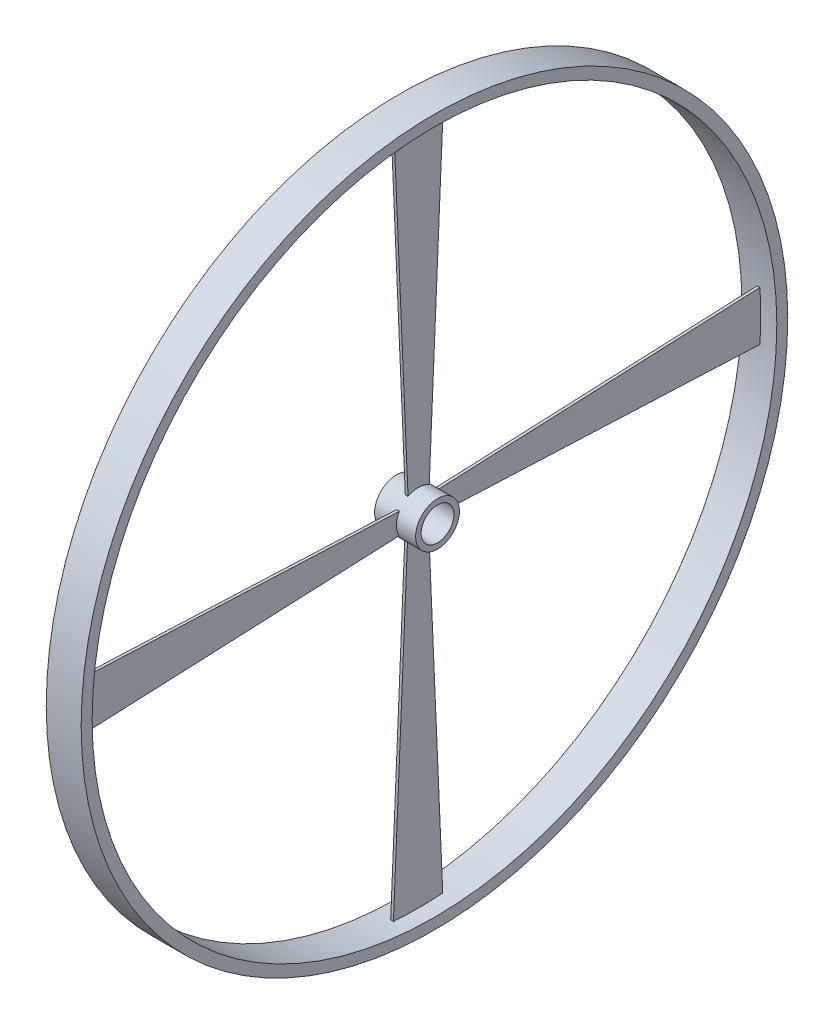
ISO-10303-21;
HEADER;
FILE_DESCRIPTION(('STEP AP214'),'2;1');
FILE_NAME('part.step','',(''),(''),'','','');
FILE_SCHEMA(('AUTOMOTIVE_DESIGN { 1 0 10303 214 1 1 1 1 }'));
ENDSEC;
DATA;
#1=APPLICATION_CONTEXT('core data for automotive mechanical design processes');
#2=APPLICATION_PROTOCOL_DEFINITION('international standard','automotive_design',2000,#1);
#3=PRODUCT_CONTEXT('',#1,'mechanical');
#4=PRODUCT('Part','Part','',(#3));
#5=PRODUCT_RELATED_PRODUCT_CATEGORY('part','',(#4));
#6=PRODUCT_DEFINITION_FORMATION('','',#4);
#7=PRODUCT_DEFINITION_CONTEXT('part definition',#1,'design');
#8=PRODUCT_DEFINITION('design','',#6,#7);
#9=PRODUCT_DEFINITION_SHAPE('','',#8);
#10=(LENGTH_UNIT() NAMED_UNIT(*) SI_UNIT(.MILLI.,.METRE.));
#11=(NAMED_UNIT(*) PLANE_ANGLE_UNIT() SI_UNIT($,.RADIAN.));
#12=(NAMED_UNIT(*) SI_UNIT($,.STERADIAN.) SOLID_ANGLE_UNIT());
#13=UNCERTAINTY_MEASURE_WITH_UNIT(LENGTH_MEASURE(1.E-05),#10,'distance_accuracy_value','');
#14=(GEOMETRIC_REPRESENTATION_CONTEXT(3) GLOBAL_UNCERTAINTY_ASSIGNED_CONTEXT((#13)) GLOBAL_UNIT_ASSIGNED_CONTEXT((#10,
#11,#12)) REPRESENTATION_CONTEXT('',''));
#15=CARTESIAN_POINT('',(0.,0.,0.));
#16=DIRECTION('',(0.,0.,1.));
#17=DIRECTION('',(1.,0.,0.));
#18=AXIS2_PLACEMENT_3D('',#15,#16,#17);
#19=CARTESIAN_POINT('',(6.375,0.,0.));
#20=DIRECTION('',(1.,0.,0.));
#21=DIRECTION('',(0.,0.,-1.));
#22=AXIS2_PLACEMENT_3D('',#19,#20,#21);
#23=PLANE('',#22);
#24=CARTESIAN_POINT('',(6.375,0.,0.));
#25=DIRECTION('',(1.,0.,0.));
#26=DIRECTION('',(0.,0.,-1.));
#27=AXIS2_PLACEMENT_3D('',#24,#25,#26);
#28=CIRCLE('',#27,129.);
#29=CARTESIAN_POINT('',(6.375,0.,-129.));
#30=VERTEX_POINT('',#29);
#31=EDGE_CURVE('E12',#30,#30,#28,.T.);
#32=ORIENTED_EDGE('',*,*,#31,.T.);
#33=EDGE_LOOP('',(#32));
#34=FACE_BOUND('',#33,.T.);
#35=CARTESIAN_POINT('',(6.375,0.,0.));
#36=DIRECTION('',(1.,0.,0.));
#37=DIRECTION('',(0.,0.,-1.));
#38=AXIS2_PLACEMENT_3D('',#35,#36,#37);
#39=CIRCLE('',#38,125.);
#40=CARTESIAN_POINT('',(6.375,0.,-125.));
#41=VERTEX_POINT('',#40);
#42=EDGE_CURVE('E375',#41,#41,#39,.T.);
#43=ORIENTED_EDGE('',*,*,#42,.F.);
#44=EDGE_LOOP('',(#43));
#45=FACE_BOUND('',#44,.T.);
#46=ADVANCED_FACE('F133',(#34,#45),#23,.T.);
#47=CARTESIAN_POINT('',(-6.375,0.,0.));
#48=DIRECTION('',(1.,0.,0.));
#49=DIRECTION('',(0.,0.,-1.));
#50=AXIS2_PLACEMENT_3D('',#47,#48,#49);
#51=PLANE('',#50);
#52=CARTESIAN_POINT('',(-6.375,0.,0.));
#53=DIRECTION('',(1.,0.,0.));
#54=DIRECTION('',(0.,0.,-1.));
#55=AXIS2_PLACEMENT_3D('',#52,#53,#54);
#56=CIRCLE('',#55,129.);
#57=CARTESIAN_POINT('',(-6.375,0.,-129.));
#58=VERTEX_POINT('',#57);
#59=EDGE_CURVE('E137',#58,#58,#56,.T.);
#60=ORIENTED_EDGE('',*,*,#59,.F.);
#61=EDGE_LOOP('',(#60));
#62=FACE_BOUND('',#61,.T.);
#63=CARTESIAN_POINT('',(-6.375,0.,0.));
#64=DIRECTION('',(1.,0.,0.));
#65=DIRECTION('',(0.,0.,-1.));
#66=AXIS2_PLACEMENT_3D('',#63,#64,#65);
#67=CIRCLE('',#66,125.);
#68=CARTESIAN_POINT('',(-6.375,0.,-125.));
#69=VERTEX_POINT('',#68);
#70=EDGE_CURVE('E374',#69,#69,#67,.T.);
#71=ORIENTED_EDGE('',*,*,#70,.T.);
#72=EDGE_LOOP('',(#71));
#73=FACE_BOUND('',#72,.T.);
#74=ADVANCED_FACE('F381',(#62,#73),#51,.F.);
#75=CARTESIAN_POINT('',(6.375,0.,0.));
#76=DIRECTION('',(-1.,0.,0.));
#77=DIRECTION('',(0.,0.,1.));
#78=AXIS2_PLACEMENT_3D('',#75,#76,#77);
#79=CYLINDRICAL_SURFACE('',#78,129.);
#80=ORIENTED_EDGE('',*,*,#31,.F.);
#81=EDGE_LOOP('',(#80));
#82=FACE_BOUND('',#81,.T.);
#83=ORIENTED_EDGE('',*,*,#59,.T.);
#84=EDGE_LOOP('',(#83));
#85=FACE_BOUND('',#84,.T.);
#86=ADVANCED_FACE('F135',(#82,#85),#79,.T.);
#87=CARTESIAN_POINT('',(6.375,0.,0.));
#88=DIRECTION('',(-1.,0.,0.));
#89=DIRECTION('',(0.,0.,1.));
#90=AXIS2_PLACEMENT_3D('',#87,#88,#89);
#91=CYLINDRICAL_SURFACE('',#90,125.);
#92=CARTESIAN_POINT('',(0.5,0.,0.));
#93=DIRECTION('',(1.,0.,0.));
#94=DIRECTION('',(0.,0.,-1.));
#95=AXIS2_PLACEMENT_3D('',#92,#93,#94);
#96=CIRCLE('',#95,125.);
#97=CARTESIAN_POINT('',(0.5,-124.667804941746,9.10705281673354));
#98=VERTEX_POINT('',#97);
#99=CARTESIAN_POINT('',(0.5,-124.68244393819,-8.90439069223882));
#100=VERTEX_POINT('',#99);
#101=EDGE_CURVE('E629',#98,#100,#96,.T.);
#102=ORIENTED_EDGE('',*,*,#101,.F.);
#103=DIRECTION('',(-1.,0.,0.));
#104=VECTOR('',#103,1.);
#105=CARTESIAN_POINT('',(0.5,-124.667804941746,9.10705281673354));
#106=LINE('',#105,#104);
#107=CARTESIAN_POINT('',(-0.5,-124.667804941746,9.10705281673354));
#108=VERTEX_POINT('',#107);
#109=EDGE_CURVE('E282',#98,#108,#106,.T.);
#110=ORIENTED_EDGE('',*,*,#109,.T.);
#111=CARTESIAN_POINT('',(-0.5,0.,0.));
#112=DIRECTION('',(1.,0.,0.));
#113=DIRECTION('',(0.,0.,-1.));
#114=AXIS2_PLACEMENT_3D('',#111,#112,#113);
#115=CIRCLE('',#114,125.);
#116=CARTESIAN_POINT('',(-0.5,-124.68244393819,-8.90439069223882));
#117=VERTEX_POINT('',#116);
#118=EDGE_CURVE('E268',#108,#117,#115,.T.);
#119=ORIENTED_EDGE('',*,*,#118,.T.);
#120=DIRECTION('',(-1.,0.,0.));
#121=VECTOR('',#120,1.);
#122=CARTESIAN_POINT('',(0.5,-124.68244393819,-8.90439069223882));
#123=LINE('',#122,#121);
#124=EDGE_CURVE('E280',#100,#117,#123,.T.);
#125=ORIENTED_EDGE('',*,*,#124,.F.);
#126=EDGE_LOOP('',(#102,#110,#119,#125));
#127=FACE_BOUND('',#126,.T.);
#128=CARTESIAN_POINT('',(0.5,0.,0.));
#129=DIRECTION('',(1.,0.,0.));
#130=DIRECTION('',(0.,0.,-1.));
#131=AXIS2_PLACEMENT_3D('',#128,#129,#130);
#132=CIRCLE('',#131,125.);
#133=CARTESIAN_POINT('',(0.5,-9.10705281673353,-124.667804941746));
#134=VERTEX_POINT('',#133);
#135=CARTESIAN_POINT('',(0.5,8.90439069223882,-124.68244393819));
#136=VERTEX_POINT('',#135);
#137=EDGE_CURVE('E287',#134,#136,#132,.T.);
#138=ORIENTED_EDGE('',*,*,#137,.F.);
#139=DIRECTION('',(-1.,0.,0.));
#140=VECTOR('',#139,1.);
#141=CARTESIAN_POINT('',(0.5,-9.10705281673353,-124.667804941746));
#142=LINE('',#141,#140);
#143=CARTESIAN_POINT('',(-0.5,-9.10705281673353,-124.667804941746));
#144=VERTEX_POINT('',#143);
#145=EDGE_CURVE('E309',#134,#144,#142,.T.);
#146=ORIENTED_EDGE('',*,*,#145,.T.);
#147=CARTESIAN_POINT('',(-0.5,0.,0.));
#148=DIRECTION('',(1.,0.,0.));
#149=DIRECTION('',(0.,0.,-1.));
#150=AXIS2_PLACEMENT_3D('',#147,#148,#149);
#151=CIRCLE('',#150,125.);
#152=CARTESIAN_POINT('',(-0.5,8.90439069223882,-124.68244393819));
#153=VERTEX_POINT('',#152);
#154=EDGE_CURVE('E298',#144,#153,#151,.T.);
#155=ORIENTED_EDGE('',*,*,#154,.T.);
#156=DIRECTION('',(-1.,0.,0.));
#157=VECTOR('',#156,1.);
#158=CARTESIAN_POINT('',(0.5,8.90439069223882,-124.68244393819));
#159=LINE('',#158,#157);
#160=EDGE_CURVE('E307',#136,#153,#159,.T.);
#161=ORIENTED_EDGE('',*,*,#160,.F.);
#162=EDGE_LOOP('',(#138,#146,#155,#161));
#163=FACE_BOUND('',#162,.T.);
#164=CARTESIAN_POINT('',(0.5,0.,0.));
#165=DIRECTION('',(1.,0.,0.));
#166=DIRECTION('',(0.,0.,-1.));
#167=AXIS2_PLACEMENT_3D('',#164,#165,#166);
#168=CIRCLE('',#167,125.);
#169=CARTESIAN_POINT('',(0.5,9.10705281673351,124.667804941746));
#170=VERTEX_POINT('',#169);
#171=CARTESIAN_POINT('',(0.5,-8.90439069223885,124.68244393819));
#172=VERTEX_POINT('',#171);
#173=EDGE_CURVE('E315',#170,#172,#168,.T.);
#174=ORIENTED_EDGE('',*,*,#173,.F.);
#175=DIRECTION('',(-1.,0.,0.));
#176=VECTOR('',#175,1.);
#177=CARTESIAN_POINT('',(0.5,9.10705281673351,124.667804941746));
#178=LINE('',#177,#176);
#179=CARTESIAN_POINT('',(-0.5,9.10705281673351,124.667804941746));
#180=VERTEX_POINT('',#179);
#181=EDGE_CURVE('E340',#170,#180,#178,.T.);
#182=ORIENTED_EDGE('',*,*,#181,.T.);
#183=CARTESIAN_POINT('',(-0.5,0.,0.));
#184=DIRECTION('',(1.,0.,0.));
#185=DIRECTION('',(0.,0.,-1.));
#186=AXIS2_PLACEMENT_3D('',#183,#184,#185);
#187=CIRCLE('',#186,125.);
#188=CARTESIAN_POINT('',(-0.5,-8.90439069223885,124.68244393819));
#189=VERTEX_POINT('',#188);
#190=EDGE_CURVE('E326',#180,#189,#187,.T.);
#191=ORIENTED_EDGE('',*,*,#190,.T.);
#192=DIRECTION('',(-1.,0.,0.));
#193=VECTOR('',#192,1.);
#194=CARTESIAN_POINT('',(0.5,-8.90439069223885,124.68244393819));
#195=LINE('',#194,#193);
#196=EDGE_CURVE('E337',#172,#189,#195,.T.);
#197=ORIENTED_EDGE('',*,*,#196,.F.);
#198=EDGE_LOOP('',(#174,#182,#191,#197));
#199=FACE_BOUND('',#198,.T.);
#200=CARTESIAN_POINT('',(0.5,0.,0.));
#201=DIRECTION('',(1.,0.,0.));
#202=DIRECTION('',(0.,0.,-1.));
#203=AXIS2_PLACEMENT_3D('',#200,#201,#202);
#204=CIRCLE('',#203,125.);
#205=CARTESIAN_POINT('',(0.5,124.667804941746,-9.10705281673352));
#206=VERTEX_POINT('',#205);
#207=CARTESIAN_POINT('',(0.5,124.68244393819,8.90439069223884));
#208=VERTEX_POINT('',#207);
#209=EDGE_CURVE('E346',#206,#208,#204,.T.);
#210=ORIENTED_EDGE('',*,*,#209,.F.);
#211=DIRECTION('',(-1.,0.,0.));
#212=VECTOR('',#211,1.);
#213=CARTESIAN_POINT('',(0.5,124.667804941746,-9.10705281673352));
#214=LINE('',#213,#212);
#215=CARTESIAN_POINT('',(-0.5,124.667804941746,-9.10705281673352));
#216=VERTEX_POINT('',#215);
#217=EDGE_CURVE('E371',#206,#216,#214,.T.);
#218=ORIENTED_EDGE('',*,*,#217,.T.);
#219=CARTESIAN_POINT('',(-0.5,0.,0.));
#220=DIRECTION('',(1.,0.,0.));
#221=DIRECTION('',(0.,0.,-1.));
#222=AXIS2_PLACEMENT_3D('',#219,#220,#221);
#223=CIRCLE('',#222,125.);
#224=CARTESIAN_POINT('',(-0.5,124.68244393819,8.90439069223884));
#225=VERTEX_POINT('',#224);
#226=EDGE_CURVE('E357',#216,#225,#223,.T.);
#227=ORIENTED_EDGE('',*,*,#226,.T.);
#228=DIRECTION('',(-1.,0.,0.));
#229=VECTOR('',#228,1.);
#230=CARTESIAN_POINT('',(0.5,124.68244393819,8.90439069223884));
#231=LINE('',#230,#229);
#232=EDGE_CURVE('E368',#208,#225,#231,.T.);
#233=ORIENTED_EDGE('',*,*,#232,.F.);
#234=EDGE_LOOP('',(#210,#218,#227,#233));
#235=FACE_BOUND('',#234,.T.);
#236=ORIENTED_EDGE('',*,*,#42,.T.);
#237=EDGE_LOOP('',(#236));
#238=FACE_BOUND('',#237,.T.);
#239=ORIENTED_EDGE('',*,*,#70,.F.);
#240=EDGE_LOOP('',(#239));
#241=FACE_BOUND('',#240,.T.);
#242=ADVANCED_FACE('F383',(#127,#163,#199,#235,#238,#241),#91,.F.);
#243=CARTESIAN_POINT('',(0.5,-0.15966665822092,-3.65696770579344));
#244=DIRECTION('',(0.,0.0436193873653361,0.999048221581858));
#245=DIRECTION('',(0.,-0.999048221581858,0.0436193873653361));
#246=AXIS2_PLACEMENT_3D('',#243,#244,#245);
#247=PLANE('',#246);
#248=DIRECTION('',(0.,0.999048221581858,-0.0436193873653361));
#249=VECTOR('',#248,1.);
#250=CARTESIAN_POINT('',(-0.5,-0.15966665822092,-3.65696770579344));
#251=LINE('',#250,#249);
#252=CARTESIAN_POINT('',(-0.5,6.9470074962426,-3.96725180032087));
#253=VERTEX_POINT('',#252);
#254=EDGE_CURVE('E343',#253,#216,#251,.T.);
#255=ORIENTED_EDGE('',*,*,#254,.T.);
#256=ORIENTED_EDGE('',*,*,#217,.F.);
#257=DIRECTION('',(0.,0.999048221581858,-0.0436193873653361));
#258=VECTOR('',#257,1.);
#259=CARTESIAN_POINT('',(0.5,-0.15966665822092,-3.65696770579344));
#260=LINE('',#259,#258);
#261=CARTESIAN_POINT('',(0.5,6.9470074962426,-3.96725180032087));
#262=VERTEX_POINT('',#261);
#263=EDGE_CURVE('E344',#262,#206,#260,.T.);
#264=ORIENTED_EDGE('',*,*,#263,.F.);
#265=DIRECTION('',(-1.,0.,0.));
#266=VECTOR('',#265,1.);
#267=CARTESIAN_POINT('',(0.5,6.94700749624259,-3.96725180032087));
#268=LINE('',#267,#266);
#269=EDGE_CURVE('E354',#262,#253,#268,.T.);
#270=ORIENTED_EDGE('',*,*,#269,.T.);
#271=EDGE_LOOP('',(#255,#256,#264,#270));
#272=FACE_BOUND('',#271,.T.);
#273=ADVANCED_FACE('F385',(#272),#247,.F.);
#274=CARTESIAN_POINT('',(0.5,-0.150807221326791,3.45405324027919));
#275=DIRECTION('',(0.,-0.0436193873653362,0.999048221581858));
#276=DIRECTION('',(0.,-0.999048221581858,-0.0436193873653362));
#277=AXIS2_PLACEMENT_3D('',#274,#275,#276);
#278=PLANE('',#277);
#279=DIRECTION('',(0.,0.999048221581858,0.0436193873653362));
#280=VECTOR('',#279,1.);
#281=CARTESIAN_POINT('',(-0.5,-0.150807221326791,3.45405324027919));
#282=LINE('',#281,#280);
#283=CARTESIAN_POINT('',(-0.5,7.05667129423277,3.76873854826136));
#284=VERTEX_POINT('',#283);
#285=EDGE_CURVE('E360',#284,#225,#282,.T.);
#286=ORIENTED_EDGE('',*,*,#285,.F.);
#287=DIRECTION('',(-1.,0.,0.));
#288=VECTOR('',#287,1.);
#289=CARTESIAN_POINT('',(0.5,7.05667129423277,3.76873854826136));
#290=LINE('',#289,#288);
#291=CARTESIAN_POINT('',(0.5,7.05667129423277,3.76873854826136));
#292=VERTEX_POINT('',#291);
#293=EDGE_CURVE('E366',#292,#284,#290,.T.);
#294=ORIENTED_EDGE('',*,*,#293,.F.);
#295=DIRECTION('',(0.,0.999048221581858,0.0436193873653362));
#296=VECTOR('',#295,1.);
#297=CARTESIAN_POINT('',(0.5,-0.150807221326791,3.45405324027919));
#298=LINE('',#297,#296);
#299=EDGE_CURVE('E349',#292,#208,#298,.T.);
#300=ORIENTED_EDGE('',*,*,#299,.T.);
#301=ORIENTED_EDGE('',*,*,#232,.T.);
#302=EDGE_LOOP('',(#286,#294,#300,#301));
#303=FACE_BOUND('',#302,.T.);
#304=ADVANCED_FACE('F392',(#303),#278,.T.);
#305=CARTESIAN_POINT('',(0.5,0.,0.));
#306=DIRECTION('',(1.,0.,0.));
#307=DIRECTION('',(0.,0.,-1.));
#308=AXIS2_PLACEMENT_3D('',#305,#306,#307);
#309=PLANE('',#308);
#310=ORIENTED_EDGE('',*,*,#263,.T.);
#311=ORIENTED_EDGE('',*,*,#209,.T.);
#312=ORIENTED_EDGE('',*,*,#299,.F.);
#313=CARTESIAN_POINT('',(0.5,0.,0.));
#314=DIRECTION('',(1.,0.,0.));
#315=DIRECTION('',(0.,0.,-1.));
#316=AXIS2_PLACEMENT_3D('',#313,#314,#315);
#317=CIRCLE('',#316,8.);
#318=EDGE_CURVE('E352',#262,#292,#317,.T.);
#319=ORIENTED_EDGE('',*,*,#318,.F.);
#320=EDGE_LOOP('',(#310,#311,#312,#319));
#321=FACE_BOUND('',#320,.T.);
#322=ADVANCED_FACE('F437',(#321),#309,.T.);
#323=CARTESIAN_POINT('',(-0.5,0.,0.));
#324=DIRECTION('',(1.,0.,0.));
#325=DIRECTION('',(0.,0.,-1.));
#326=AXIS2_PLACEMENT_3D('',#323,#324,#325);
#327=PLANE('',#326);
#328=ORIENTED_EDGE('',*,*,#254,.F.);
#329=CARTESIAN_POINT('',(-0.5,0.,0.));
#330=DIRECTION('',(1.,0.,0.));
#331=DIRECTION('',(0.,0.,-1.));
#332=AXIS2_PLACEMENT_3D('',#329,#330,#331);
#333=CIRCLE('',#332,8.);
#334=EDGE_CURVE('E347',#253,#284,#333,.T.);
#335=ORIENTED_EDGE('',*,*,#334,.T.);
#336=ORIENTED_EDGE('',*,*,#285,.T.);
#337=ORIENTED_EDGE('',*,*,#226,.F.);
#338=EDGE_LOOP('',(#328,#335,#336,#337));
#339=FACE_BOUND('',#338,.T.);
#340=ADVANCED_FACE('F447',(#339),#327,.F.);
#341=CARTESIAN_POINT('',(0.5,3.65696770579352,-0.159666658220921));
#342=DIRECTION('',(0.,-0.999048221581858,0.0436193873653354));
#343=DIRECTION('',(0.,-0.0436193873653354,-0.999048221581858));
#344=AXIS2_PLACEMENT_3D('',#341,#342,#343);
#345=PLANE('',#344);
#346=DIRECTION('',(0.,0.0436193873653354,0.999048221581858));
#347=VECTOR('',#346,1.);
#348=CARTESIAN_POINT('',(-0.5,3.65696770579352,-0.159666658220921));
#349=LINE('',#348,#347);
#350=CARTESIAN_POINT('',(-0.5,3.96725180032094,6.94700749624255));
#351=VERTEX_POINT('',#350);
#352=EDGE_CURVE('E312',#351,#180,#349,.T.);
#353=ORIENTED_EDGE('',*,*,#352,.T.);
#354=ORIENTED_EDGE('',*,*,#181,.F.);
#355=DIRECTION('',(0.,0.0436193873653354,0.999048221581858));
#356=VECTOR('',#355,1.);
#357=CARTESIAN_POINT('',(0.5,3.65696770579352,-0.159666658220921));
#358=LINE('',#357,#356);
#359=CARTESIAN_POINT('',(0.5,3.96725180032095,6.94700749624255));
#360=VERTEX_POINT('',#359);
#361=EDGE_CURVE('E313',#360,#170,#358,.T.);
#362=ORIENTED_EDGE('',*,*,#361,.F.);
#363=DIRECTION('',(-1.,0.,0.));
#364=VECTOR('',#363,1.);
#365=CARTESIAN_POINT('',(0.5,3.96725180032094,6.94700749624255));
#366=LINE('',#365,#364);
#367=EDGE_CURVE('E323',#360,#351,#366,.T.);
#368=ORIENTED_EDGE('',*,*,#367,.T.);
#369=EDGE_LOOP('',(#353,#354,#362,#368));
#370=FACE_BOUND('',#369,.T.);
#371=ADVANCED_FACE('F457',(#370),#345,.F.);
#372=CARTESIAN_POINT('',(0.5,-3.45405324027911,-0.15080722132679));
#373=DIRECTION('',(0.,-0.999048221581858,-0.0436193873653369));
#374=DIRECTION('',(0.,0.0436193873653369,-0.999048221581858));
#375=AXIS2_PLACEMENT_3D('',#372,#373,#374);
#376=PLANE('',#375);
#377=DIRECTION('',(0.,-0.0436193873653369,0.999048221581858));
#378=VECTOR('',#377,1.);
#379=CARTESIAN_POINT('',(-0.5,-3.45405324027911,-0.15080722132679));
#380=LINE('',#379,#378);
#381=CARTESIAN_POINT('',(-0.5,-3.76873854826129,7.05667129423281));
#382=VERTEX_POINT('',#381);
#383=EDGE_CURVE('E329',#382,#189,#380,.T.);
#384=ORIENTED_EDGE('',*,*,#383,.F.);
#385=DIRECTION('',(-1.,0.,0.));
#386=VECTOR('',#385,1.);
#387=CARTESIAN_POINT('',(0.5,-3.76873854826129,7.05667129423281));
#388=LINE('',#387,#386);
#389=CARTESIAN_POINT('',(0.5,-3.76873854826129,7.05667129423281));
#390=VERTEX_POINT('',#389);
#391=EDGE_CURVE('E335',#390,#382,#388,.T.);
#392=ORIENTED_EDGE('',*,*,#391,.F.);
#393=DIRECTION('',(0.,-0.0436193873653369,0.999048221581858));
#394=VECTOR('',#393,1.);
#395=CARTESIAN_POINT('',(0.5,-3.45405324027911,-0.15080722132679));
#396=LINE('',#395,#394);
#397=EDGE_CURVE('E318',#390,#172,#396,.T.);
#398=ORIENTED_EDGE('',*,*,#397,.T.);
#399=ORIENTED_EDGE('',*,*,#196,.T.);
#400=EDGE_LOOP('',(#384,#392,#398,#399));
#401=FACE_BOUND('',#400,.T.);
#402=ADVANCED_FACE('F467',(#401),#376,.T.);
#403=CARTESIAN_POINT('',(0.5,0.,0.));
#404=DIRECTION('',(1.,0.,0.));
#405=DIRECTION('',(0.,0.,-1.));
#406=AXIS2_PLACEMENT_3D('',#403,#404,#405);
#407=PLANE('',#406);
#408=ORIENTED_EDGE('',*,*,#361,.T.);
#409=ORIENTED_EDGE('',*,*,#173,.T.);
#410=ORIENTED_EDGE('',*,*,#397,.F.);
#411=CARTESIAN_POINT('',(0.5,0.,0.));
#412=DIRECTION('',(1.,0.,0.));
#413=DIRECTION('',(0.,0.,-1.));
#414=AXIS2_PLACEMENT_3D('',#411,#412,#413);
#415=CIRCLE('',#414,8.);
#416=EDGE_CURVE('E321',#360,#390,#415,.T.);
#417=ORIENTED_EDGE('',*,*,#416,.F.);
#418=EDGE_LOOP('',(#408,#409,#410,#417));
#419=FACE_BOUND('',#418,.T.);
#420=ADVANCED_FACE('F477',(#419),#407,.T.);
#421=CARTESIAN_POINT('',(-0.5,0.,0.));
#422=DIRECTION('',(1.,0.,0.));
#423=DIRECTION('',(0.,0.,-1.));
#424=AXIS2_PLACEMENT_3D('',#421,#422,#423);
#425=PLANE('',#424);
#426=ORIENTED_EDGE('',*,*,#352,.F.);
#427=CARTESIAN_POINT('',(-0.5,0.,0.));
#428=DIRECTION('',(1.,0.,0.));
#429=DIRECTION('',(0.,0.,-1.));
#430=AXIS2_PLACEMENT_3D('',#427,#428,#429);
#431=CIRCLE('',#430,8.);
#432=EDGE_CURVE('E316',#351,#382,#431,.T.);
#433=ORIENTED_EDGE('',*,*,#432,.T.);
#434=ORIENTED_EDGE('',*,*,#383,.T.);
#435=ORIENTED_EDGE('',*,*,#190,.F.);
#436=EDGE_LOOP('',(#426,#433,#434,#435));
#437=FACE_BOUND('',#436,.T.);
#438=ADVANCED_FACE('F487',(#437),#425,.F.);
#439=CARTESIAN_POINT('',(0.5,-3.65696770579347,0.159666658220921));
#440=DIRECTION('',(0.,0.999048221581858,-0.043619387365336));
#441=DIRECTION('',(0.,0.043619387365336,0.999048221581858));
#442=AXIS2_PLACEMENT_3D('',#439,#440,#441);
#443=PLANE('',#442);
#444=DIRECTION('',(0.,-0.043619387365336,-0.999048221581858));
#445=VECTOR('',#444,1.);
#446=CARTESIAN_POINT('',(-0.5,-3.65696770579347,0.159666658220921));
#447=LINE('',#446,#445);
#448=CARTESIAN_POINT('',(-0.5,-3.9672518003209,-6.94700749624258));
#449=VERTEX_POINT('',#448);
#450=EDGE_CURVE('E284',#449,#144,#447,.T.);
#451=ORIENTED_EDGE('',*,*,#450,.T.);
#452=ORIENTED_EDGE('',*,*,#145,.F.);
#453=DIRECTION('',(0.,-0.043619387365336,-0.999048221581858));
#454=VECTOR('',#453,1.);
#455=CARTESIAN_POINT('',(0.5,-3.65696770579347,0.159666658220921));
#456=LINE('',#455,#454);
#457=CARTESIAN_POINT('',(0.5,-3.9672518003209,-6.94700749624258));
#458=VERTEX_POINT('',#457);
#459=EDGE_CURVE('E285',#458,#134,#456,.T.);
#460=ORIENTED_EDGE('',*,*,#459,.F.);
#461=DIRECTION('',(-1.,0.,0.));
#462=VECTOR('',#461,1.);
#463=CARTESIAN_POINT('',(0.5,-3.9672518003209,-6.94700749624258));
#464=LINE('',#463,#462);
#465=EDGE_CURVE('E295',#458,#449,#464,.T.);
#466=ORIENTED_EDGE('',*,*,#465,.T.);
#467=EDGE_LOOP('',(#451,#452,#460,#466));
#468=FACE_BOUND('',#467,.T.);
#469=ADVANCED_FACE('F497',(#468),#443,.F.);
#470=CARTESIAN_POINT('',(0.5,3.45405324027916,0.150807221326791));
#471=DIRECTION('',(0.,0.999048221581858,0.0436193873653363));
#472=DIRECTION('',(0.,-0.0436193873653363,0.999048221581858));
#473=AXIS2_PLACEMENT_3D('',#470,#471,#472);
#474=PLANE('',#473);
#475=DIRECTION('',(0.,0.0436193873653363,-0.999048221581858));
#476=VECTOR('',#475,1.);
#477=CARTESIAN_POINT('',(-0.5,3.45405324027916,0.150807221326791));
#478=LINE('',#477,#476);
#479=CARTESIAN_POINT('',(-0.5,3.76873854826134,-7.05667129423279));
#480=VERTEX_POINT('',#479);
#481=EDGE_CURVE('E156',#480,#153,#478,.T.);
#482=ORIENTED_EDGE('',*,*,#481,.F.);
#483=DIRECTION('',(-1.,0.,0.));
#484=VECTOR('',#483,1.);
#485=CARTESIAN_POINT('',(0.5,3.76873854826134,-7.05667129423279));
#486=LINE('',#485,#484);
#487=CARTESIAN_POINT('',(0.5,3.76873854826134,-7.05667129423279));
#488=VERTEX_POINT('',#487);
#489=EDGE_CURVE('E305',#488,#480,#486,.T.);
#490=ORIENTED_EDGE('',*,*,#489,.F.);
#491=DIRECTION('',(0.,0.0436193873653363,-0.999048221581858));
#492=VECTOR('',#491,1.);
#493=CARTESIAN_POINT('',(0.5,3.45405324027916,0.150807221326791));
#494=LINE('',#493,#492);
#495=EDGE_CURVE('E290',#488,#136,#494,.T.);
#496=ORIENTED_EDGE('',*,*,#495,.T.);
#497=ORIENTED_EDGE('',*,*,#160,.T.);
#498=EDGE_LOOP('',(#482,#490,#496,#497));
#499=FACE_BOUND('',#498,.T.);
#500=ADVANCED_FACE('F507',(#499),#474,.T.);
#501=CARTESIAN_POINT('',(0.5,0.,0.));
#502=DIRECTION('',(1.,0.,0.));
#503=DIRECTION('',(0.,0.,-1.));
#504=AXIS2_PLACEMENT_3D('',#501,#502,#503);
#505=PLANE('',#504);
#506=ORIENTED_EDGE('',*,*,#459,.T.);
#507=ORIENTED_EDGE('',*,*,#137,.T.);
#508=ORIENTED_EDGE('',*,*,#495,.F.);
#509=CARTESIAN_POINT('',(0.5,0.,0.));
#510=DIRECTION('',(1.,0.,0.));
#511=DIRECTION('',(0.,0.,-1.));
#512=AXIS2_PLACEMENT_3D('',#509,#510,#511);
#513=CIRCLE('',#512,8.);
#514=EDGE_CURVE('E293',#458,#488,#513,.T.);
#515=ORIENTED_EDGE('',*,*,#514,.F.);
#516=EDGE_LOOP('',(#506,#507,#508,#515));
#517=FACE_BOUND('',#516,.T.);
#518=ADVANCED_FACE('F517',(#517),#505,.T.);
#519=CARTESIAN_POINT('',(-0.5,0.,0.));
#520=DIRECTION('',(1.,0.,0.));
#521=DIRECTION('',(0.,0.,-1.));
#522=AXIS2_PLACEMENT_3D('',#519,#520,#521);
#523=PLANE('',#522);
#524=ORIENTED_EDGE('',*,*,#450,.F.);
#525=CARTESIAN_POINT('',(-0.5,0.,0.));
#526=DIRECTION('',(1.,0.,0.));
#527=DIRECTION('',(0.,0.,-1.));
#528=AXIS2_PLACEMENT_3D('',#525,#526,#527);
#529=CIRCLE('',#528,8.);
#530=EDGE_CURVE('E288',#449,#480,#529,.T.);
#531=ORIENTED_EDGE('',*,*,#530,.T.);
#532=ORIENTED_EDGE('',*,*,#481,.T.);
#533=ORIENTED_EDGE('',*,*,#154,.F.);
#534=EDGE_LOOP('',(#524,#531,#532,#533));
#535=FACE_BOUND('',#534,.T.);
#536=ADVANCED_FACE('F527',(#535),#523,.F.);
#537=CARTESIAN_POINT('',(0.5,0.159666658220921,3.65696770579349));
#538=DIRECTION('',(0.,-0.0436193873653358,-0.999048221581858));
#539=DIRECTION('',(0.,0.999048221581858,-0.0436193873653358));
#540=AXIS2_PLACEMENT_3D('',#537,#538,#539);
#541=PLANE('',#540);
#542=DIRECTION('',(0.,-0.999048221581858,0.0436193873653358));
#543=VECTOR('',#542,1.);
#544=CARTESIAN_POINT('',(-0.5,0.159666658220921,3.65696770579349));
#545=LINE('',#544,#543);
#546=CARTESIAN_POINT('',(-0.5,-6.94700749624257,3.96725180032092));
#547=VERTEX_POINT('',#546);
#548=EDGE_CURVE('E261',#547,#108,#545,.T.);
#549=ORIENTED_EDGE('',*,*,#548,.T.);
#550=ORIENTED_EDGE('',*,*,#109,.F.);
#551=DIRECTION('',(0.,-0.999048221581858,0.0436193873653358));
#552=VECTOR('',#551,1.);
#553=CARTESIAN_POINT('',(0.5,0.159666658220921,3.65696770579349));
#554=LINE('',#553,#552);
#555=CARTESIAN_POINT('',(0.5,-6.94700749624257,3.96725180032092));
#556=VERTEX_POINT('',#555);
#557=EDGE_CURVE('E255',#556,#98,#554,.T.);
#558=ORIENTED_EDGE('',*,*,#557,.F.);
#559=DIRECTION('',(-1.,0.,0.));
#560=VECTOR('',#559,1.);
#561=CARTESIAN_POINT('',(0.5,-6.94700749624257,3.96725180032092));
#562=LINE('',#561,#560);
#563=EDGE_CURVE('E250',#556,#547,#562,.T.);
#564=ORIENTED_EDGE('',*,*,#563,.T.);
#565=EDGE_LOOP('',(#549,#550,#558,#564));
#566=FACE_BOUND('',#565,.T.);
#567=ADVANCED_FACE('F259',(#566),#541,.F.);
#568=CARTESIAN_POINT('',(0.5,0.15080722132679,-3.45405324027914));
#569=DIRECTION('',(0.,0.0436193873653365,-0.999048221581858));
#570=DIRECTION('',(0.,0.999048221581858,0.0436193873653365));
#571=AXIS2_PLACEMENT_3D('',#568,#569,#570);
#572=PLANE('',#571);
#573=DIRECTION('',(0.,-0.999048221581858,-0.0436193873653365));
#574=VECTOR('',#573,1.);
#575=CARTESIAN_POINT('',(-0.5,0.15080722132679,-3.45405324027914));
#576=LINE('',#575,#574);
#577=CARTESIAN_POINT('',(-0.5,-7.0566712942328,-3.76873854826131));
#578=VERTEX_POINT('',#577);
#579=EDGE_CURVE('E148',#578,#117,#576,.T.);
#580=ORIENTED_EDGE('',*,*,#579,.F.);
#581=DIRECTION('',(-1.,0.,0.));
#582=VECTOR('',#581,1.);
#583=CARTESIAN_POINT('',(0.5,-7.0566712942328,-3.76873854826131));
#584=LINE('',#583,#582);
#585=CARTESIAN_POINT('',(0.5,-7.0566712942328,-3.76873854826131));
#586=VERTEX_POINT('',#585);
#587=EDGE_CURVE('E253',#586,#578,#584,.T.);
#588=ORIENTED_EDGE('',*,*,#587,.F.);
#589=DIRECTION('',(0.,-0.999048221581858,-0.0436193873653365));
#590=VECTOR('',#589,1.);
#591=CARTESIAN_POINT('',(0.5,0.15080722132679,-3.45405324027914));
#592=LINE('',#591,#590);
#593=EDGE_CURVE('E630',#586,#100,#592,.T.);
#594=ORIENTED_EDGE('',*,*,#593,.T.);
#595=ORIENTED_EDGE('',*,*,#124,.T.);
#596=EDGE_LOOP('',(#580,#588,#594,#595));
#597=FACE_BOUND('',#596,.T.);
#598=ADVANCED_FACE('F545',(#597),#572,.T.);
#599=CARTESIAN_POINT('',(0.5,0.,0.));
#600=DIRECTION('',(1.,0.,0.));
#601=DIRECTION('',(0.,0.,-1.));
#602=AXIS2_PLACEMENT_3D('',#599,#600,#601);
#603=PLANE('',#602);
#604=ORIENTED_EDGE('',*,*,#557,.T.);
#605=ORIENTED_EDGE('',*,*,#101,.T.);
#606=ORIENTED_EDGE('',*,*,#593,.F.);
#607=CARTESIAN_POINT('',(0.5,0.,0.));
#608=DIRECTION('',(1.,0.,0.));
#609=DIRECTION('',(0.,0.,-1.));
#610=AXIS2_PLACEMENT_3D('',#607,#608,#609);
#611=CIRCLE('',#610,8.);
#612=EDGE_CURVE('E264',#556,#586,#611,.T.);
#613=ORIENTED_EDGE('',*,*,#612,.F.);
#614=EDGE_LOOP('',(#604,#605,#606,#613));
#615=FACE_BOUND('',#614,.T.);
#616=ADVANCED_FACE('F554',(#615),#603,.T.);
#617=CARTESIAN_POINT('',(-0.5,0.,0.));
#618=DIRECTION('',(1.,0.,0.));
#619=DIRECTION('',(0.,0.,-1.));
#620=AXIS2_PLACEMENT_3D('',#617,#618,#619);
#621=PLANE('',#620);
#622=ORIENTED_EDGE('',*,*,#548,.F.);
#623=CARTESIAN_POINT('',(-0.5,0.,0.));
#624=DIRECTION('',(1.,0.,0.));
#625=DIRECTION('',(0.,0.,-1.));
#626=AXIS2_PLACEMENT_3D('',#623,#624,#625);
#627=CIRCLE('',#626,8.);
#628=EDGE_CURVE('E246',#547,#578,#627,.T.);
#629=ORIENTED_EDGE('',*,*,#628,.T.);
#630=ORIENTED_EDGE('',*,*,#579,.T.);
#631=ORIENTED_EDGE('',*,*,#118,.F.);
#632=EDGE_LOOP('',(#622,#629,#630,#631));
#633=FACE_BOUND('',#632,.T.);
#634=ADVANCED_FACE('F266',(#633),#621,.F.);
#635=CARTESIAN_POINT('',(7.5,0.,0.));
#636=DIRECTION('',(-1.,0.,0.));
#637=DIRECTION('',(0.,0.,1.));
#638=AXIS2_PLACEMENT_3D('',#635,#636,#637);
#639=CYLINDRICAL_SURFACE('',#638,6.);
#640=CARTESIAN_POINT('',(7.5,0.,0.));
#641=DIRECTION('',(1.,0.,0.));
#642=DIRECTION('',(0.,0.,-1.));
#643=AXIS2_PLACEMENT_3D('',#640,#641,#642);
#644=CIRCLE('',#643,6.);
#645=CARTESIAN_POINT('',(7.5,0.,-6.));
#646=VERTEX_POINT('',#645);
#647=EDGE_CURVE('E273',#646,#646,#644,.T.);
#648=ORIENTED_EDGE('',*,*,#647,.T.);
#649=EDGE_LOOP('',(#648));
#650=FACE_BOUND('',#649,.T.);
#651=CARTESIAN_POINT('',(-7.5,0.,0.));
#652=DIRECTION('',(1.,0.,0.));
#653=DIRECTION('',(0.,0.,-1.));
#654=AXIS2_PLACEMENT_3D('',#651,#652,#653);
#655=CIRCLE('',#654,6.);
#656=CARTESIAN_POINT('',(-7.5,0.,-6.));
#657=VERTEX_POINT('',#656);
#658=EDGE_CURVE('E618',#657,#657,#655,.T.);
#659=ORIENTED_EDGE('',*,*,#658,.F.);
#660=EDGE_LOOP('',(#659));
#661=FACE_BOUND('',#660,.T.);
#662=ADVANCED_FACE('F573',(#650,#661),#639,.F.);
#663=CARTESIAN_POINT('',(7.5,0.,0.));
#664=DIRECTION('',(-1.,0.,0.));
#665=DIRECTION('',(0.,0.,1.));
#666=AXIS2_PLACEMENT_3D('',#663,#664,#665);
#667=CYLINDRICAL_SURFACE('',#666,8.);
#668=ORIENTED_EDGE('',*,*,#318,.T.);
#669=ORIENTED_EDGE('',*,*,#293,.T.);
#670=ORIENTED_EDGE('',*,*,#334,.F.);
#671=ORIENTED_EDGE('',*,*,#269,.F.);
#672=EDGE_LOOP('',(#668,#669,#670,#671));
#673=FACE_BOUND('',#672,.T.);
#674=ORIENTED_EDGE('',*,*,#416,.T.);
#675=ORIENTED_EDGE('',*,*,#391,.T.);
#676=ORIENTED_EDGE('',*,*,#432,.F.);
#677=ORIENTED_EDGE('',*,*,#367,.F.);
#678=EDGE_LOOP('',(#674,#675,#676,#677));
#679=FACE_BOUND('',#678,.T.);
#680=ORIENTED_EDGE('',*,*,#514,.T.);
#681=ORIENTED_EDGE('',*,*,#489,.T.);
#682=ORIENTED_EDGE('',*,*,#530,.F.);
#683=ORIENTED_EDGE('',*,*,#465,.F.);
#684=EDGE_LOOP('',(#680,#681,#682,#683));
#685=FACE_BOUND('',#684,.T.);
#686=ORIENTED_EDGE('',*,*,#612,.T.);
#687=ORIENTED_EDGE('',*,*,#587,.T.);
#688=ORIENTED_EDGE('',*,*,#628,.F.);
#689=ORIENTED_EDGE('',*,*,#563,.F.);
#690=EDGE_LOOP('',(#686,#687,#688,#689));
#691=FACE_BOUND('',#690,.T.);
#692=CARTESIAN_POINT('',(7.5,0.,0.));
#693=DIRECTION('',(1.,0.,0.));
#694=DIRECTION('',(0.,0.,-1.));
#695=AXIS2_PLACEMENT_3D('',#692,#693,#694);
#696=CIRCLE('',#695,8.);
#697=CARTESIAN_POINT('',(7.5,0.,-8.));
#698=VERTEX_POINT('',#697);
#699=EDGE_CURVE('E269',#698,#698,#696,.T.);
#700=ORIENTED_EDGE('',*,*,#699,.F.);
#701=EDGE_LOOP('',(#700));
#702=FACE_BOUND('',#701,.T.);
#703=CARTESIAN_POINT('',(-7.5,0.,0.));
#704=DIRECTION('',(1.,0.,0.));
#705=DIRECTION('',(0.,0.,-1.));
#706=AXIS2_PLACEMENT_3D('',#703,#704,#705);
#707=CIRCLE('',#706,8.);
#708=CARTESIAN_POINT('',(-7.5,0.,-8.));
#709=VERTEX_POINT('',#708);
#710=EDGE_CURVE('E621',#709,#709,#707,.T.);
#711=ORIENTED_EDGE('',*,*,#710,.T.);
#712=EDGE_LOOP('',(#711));
#713=FACE_BOUND('',#712,.T.);
#714=ADVANCED_FACE('F248',(#673,#679,#685,#691,#702,#713),#667,.T.);
#715=CARTESIAN_POINT('',(7.5,0.,0.));
#716=DIRECTION('',(1.,0.,0.));
#717=DIRECTION('',(0.,0.,-1.));
#718=AXIS2_PLACEMENT_3D('',#715,#716,#717);
#719=PLANE('',#718);
#720=ORIENTED_EDGE('',*,*,#647,.F.);
#721=EDGE_LOOP('',(#720));
#722=FACE_BOUND('',#721,.T.);
#723=ORIENTED_EDGE('',*,*,#699,.T.);
#724=EDGE_LOOP('',(#723));
#725=FACE_BOUND('',#724,.T.);
#726=ADVANCED_FACE('F591',(#722,#725),#719,.T.);
#727=CARTESIAN_POINT('',(-7.5,0.,0.));
#728=DIRECTION('',(1.,0.,0.));
#729=DIRECTION('',(0.,0.,-1.));
#730=AXIS2_PLACEMENT_3D('',#727,#728,#729);
#731=PLANE('',#730);
#732=ORIENTED_EDGE('',*,*,#658,.T.);
#733=EDGE_LOOP('',(#732));
#734=FACE_BOUND('',#733,.T.);
#735=ORIENTED_EDGE('',*,*,#710,.F.);
#736=EDGE_LOOP('',(#735));
#737=FACE_BOUND('',#736,.T.);
#738=ADVANCED_FACE('F601',(#734,#737),#731,.F.);
#739=CLOSED_SHELL('',(#46,#74,#86,#242,#273,#304,#322,#340,#371,#402,#420,#438,#469,#500,#518,
#536,#567,#598,#616,#634,#662,#714,#726,#738));
#740=MANIFOLD_SOLID_BREP('B2',#739);
#741=ADVANCED_BREP_SHAPE_REPRESENTATION('',(#18,#740),#14);
#742=SHAPE_DEFINITION_REPRESENTATION(#9,#741);
ENDSEC;
END-ISO-10303-21;
